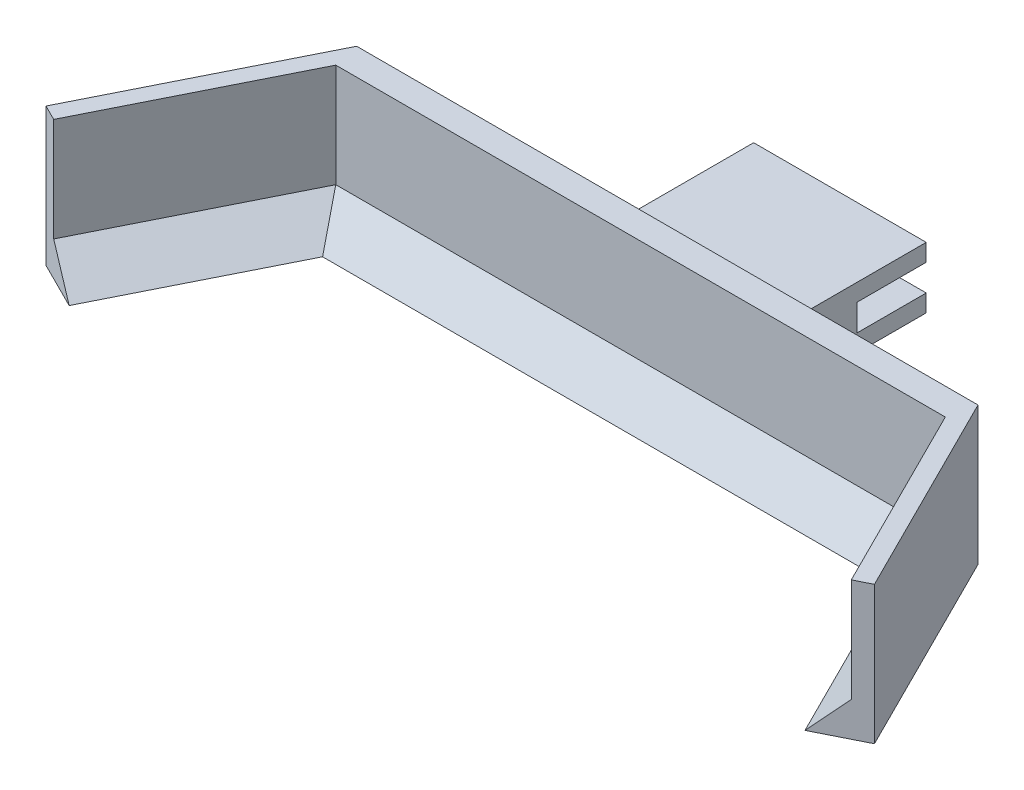
ISO-10303-21;
HEADER;
FILE_DESCRIPTION(('STEP AP214'),'2;1');
FILE_NAME('part.step','',(''),(''),'','','');
FILE_SCHEMA(('AUTOMOTIVE_DESIGN { 1 0 10303 214 1 1 1 1 }'));
ENDSEC;
DATA;
#1=APPLICATION_CONTEXT('core data for automotive mechanical design processes');
#2=APPLICATION_PROTOCOL_DEFINITION('international standard','automotive_design',2000,#1);
#3=PRODUCT_CONTEXT('',#1,'mechanical');
#4=PRODUCT('Part','Part','',(#3));
#5=PRODUCT_RELATED_PRODUCT_CATEGORY('part','',(#4));
#6=PRODUCT_DEFINITION_FORMATION('','',#4);
#7=PRODUCT_DEFINITION_CONTEXT('part definition',#1,'design');
#8=PRODUCT_DEFINITION('design','',#6,#7);
#9=PRODUCT_DEFINITION_SHAPE('','',#8);
#10=(LENGTH_UNIT() NAMED_UNIT(*) SI_UNIT(.MILLI.,.METRE.));
#11=(NAMED_UNIT(*) PLANE_ANGLE_UNIT() SI_UNIT($,.RADIAN.));
#12=(NAMED_UNIT(*) SI_UNIT($,.STERADIAN.) SOLID_ANGLE_UNIT());
#13=UNCERTAINTY_MEASURE_WITH_UNIT(LENGTH_MEASURE(1.E-05),#10,'distance_accuracy_value','');
#14=(GEOMETRIC_REPRESENTATION_CONTEXT(3) GLOBAL_UNCERTAINTY_ASSIGNED_CONTEXT((#13)) GLOBAL_UNIT_ASSIGNED_CONTEXT((#10,
#11,#12)) REPRESENTATION_CONTEXT('',''));
#15=CARTESIAN_POINT('',(0.,0.,0.));
#16=DIRECTION('',(0.,0.,1.));
#17=DIRECTION('',(1.,0.,0.));
#18=AXIS2_PLACEMENT_3D('',#15,#16,#17);
#19=CARTESIAN_POINT('',(0.,0.,-55.));
#20=DIRECTION('',(0.,0.,1.));
#21=DIRECTION('',(1.,0.,0.));
#22=AXIS2_PLACEMENT_3D('',#19,#20,#21);
#23=PLANE('',#22);
#24=DIRECTION('',(0.,-1.,0.));
#25=VECTOR('',#24,1.);
#26=CARTESIAN_POINT('',(25.,5.6,-55.));
#27=LINE('',#26,#25);
#28=CARTESIAN_POINT('',(25.,23.3,-55.));
#29=VERTEX_POINT('',#28);
#30=CARTESIAN_POINT('',(25.,18.3,-55.));
#31=VERTEX_POINT('',#30);
#32=EDGE_CURVE('E199',#29,#31,#27,.T.);
#33=ORIENTED_EDGE('',*,*,#32,.T.);
#34=DIRECTION('',(1.,0.,0.));
#35=VECTOR('',#34,1.);
#36=CARTESIAN_POINT('',(25.,18.3,-55.));
#37=LINE('',#36,#35);
#38=CARTESIAN_POINT('',(-25.,18.3,-55.));
#39=VERTEX_POINT('',#38);
#40=EDGE_CURVE('E181',#39,#31,#37,.T.);
#41=ORIENTED_EDGE('',*,*,#40,.F.);
#42=DIRECTION('',(0.,1.,0.));
#43=VECTOR('',#42,1.);
#44=CARTESIAN_POINT('',(-25.,5.6,-55.));
#45=LINE('',#44,#43);
#46=CARTESIAN_POINT('',(-25.,23.3,-55.));
#47=VERTEX_POINT('',#46);
#48=EDGE_CURVE('E197',#39,#47,#45,.T.);
#49=ORIENTED_EDGE('',*,*,#48,.T.);
#50=DIRECTION('',(1.,0.,0.));
#51=VECTOR('',#50,1.);
#52=CARTESIAN_POINT('',(25.,23.3,-55.));
#53=LINE('',#52,#51);
#54=EDGE_CURVE('E196',#47,#29,#53,.T.);
#55=ORIENTED_EDGE('',*,*,#54,.T.);
#56=EDGE_LOOP('',(#33,#41,#49,#55));
#57=FACE_BOUND('',#56,.T.);
#58=ADVANCED_FACE('F39',(#57),#23,.F.);
#59=CARTESIAN_POINT('',(-90.,10.,-5.));
#60=DIRECTION('',(0.,0.,1.));
#61=DIRECTION('',(1.,0.,0.));
#62=AXIS2_PLACEMENT_3D('',#59,#60,#61);
#63=PLANE('',#62);
#64=DIRECTION('',(-1.,0.,0.));
#65=VECTOR('',#64,1.);
#66=CARTESIAN_POINT('',(-90.,0.,-5.));
#67=LINE('',#66,#65);
#68=CARTESIAN_POINT('',(90.,0.,-5.));
#69=VERTEX_POINT('',#68);
#70=CARTESIAN_POINT('',(-90.,0.,-5.));
#71=VERTEX_POINT('',#70);
#72=EDGE_CURVE('E264',#69,#71,#67,.T.);
#73=ORIENTED_EDGE('',*,*,#72,.T.);
#74=DIRECTION('',(0.,-1.,0.));
#75=VECTOR('',#74,1.);
#76=CARTESIAN_POINT('',(-90.,10.,-5.));
#77=LINE('',#76,#75);
#78=CARTESIAN_POINT('',(-90.,40.,-5.));
#79=VERTEX_POINT('',#78);
#80=EDGE_CURVE('E270',#79,#71,#77,.T.);
#81=ORIENTED_EDGE('',*,*,#80,.F.);
#82=DIRECTION('',(-1.,0.,0.));
#83=VECTOR('',#82,1.);
#84=CARTESIAN_POINT('',(-90.,40.,-5.));
#85=LINE('',#84,#83);
#86=CARTESIAN_POINT('',(90.,40.,-5.));
#87=VERTEX_POINT('',#86);
#88=EDGE_CURVE('E241',#87,#79,#85,.T.);
#89=ORIENTED_EDGE('',*,*,#88,.F.);
#90=DIRECTION('',(0.,-1.,0.));
#91=VECTOR('',#90,1.);
#92=CARTESIAN_POINT('',(90.,10.,-5.));
#93=LINE('',#92,#91);
#94=EDGE_CURVE('E284',#87,#69,#93,.T.);
#95=ORIENTED_EDGE('',*,*,#94,.T.);
#96=EDGE_LOOP('',(#73,#81,#89,#95));
#97=FACE_BOUND('',#96,.T.);
#98=DIRECTION('',(0.,1.,0.));
#99=VECTOR('',#98,1.);
#100=CARTESIAN_POINT('',(-25.,5.6,-5.));
#101=LINE('',#100,#99);
#102=CARTESIAN_POINT('',(-25.,5.6,-5.));
#103=VERTEX_POINT('',#102);
#104=CARTESIAN_POINT('',(-25.,23.3,-5.));
#105=VERTEX_POINT('',#104);
#106=EDGE_CURVE('E64',#103,#105,#101,.T.);
#107=ORIENTED_EDGE('',*,*,#106,.F.);
#108=DIRECTION('',(-1.,0.,0.));
#109=VECTOR('',#108,1.);
#110=CARTESIAN_POINT('',(25.,5.6,-5.));
#111=LINE('',#110,#109);
#112=CARTESIAN_POINT('',(25.,5.6,-5.));
#113=VERTEX_POINT('',#112);
#114=EDGE_CURVE('E213',#113,#103,#111,.T.);
#115=ORIENTED_EDGE('',*,*,#114,.F.);
#116=DIRECTION('',(0.,-1.,0.));
#117=VECTOR('',#116,1.);
#118=CARTESIAN_POINT('',(25.,5.6,-5.));
#119=LINE('',#118,#117);
#120=CARTESIAN_POINT('',(25.,23.3,-5.));
#121=VERTEX_POINT('',#120);
#122=EDGE_CURVE('E210',#121,#113,#119,.T.);
#123=ORIENTED_EDGE('',*,*,#122,.F.);
#124=DIRECTION('',(1.,0.,0.));
#125=VECTOR('',#124,1.);
#126=CARTESIAN_POINT('',(25.,23.3,-5.));
#127=LINE('',#126,#125);
#128=EDGE_CURVE('E206',#105,#121,#127,.T.);
#129=ORIENTED_EDGE('',*,*,#128,.F.);
#130=EDGE_LOOP('',(#107,#115,#123,#129));
#131=FACE_BOUND('',#130,.T.);
#132=ADVANCED_FACE('F341',(#97,#131),#63,.F.);
#133=CARTESIAN_POINT('',(-90.,10.,-5.));
#134=DIRECTION('',(0.894427190999916,0.,0.447213595499958));
#135=DIRECTION('',(0.447213595499958,0.,-0.894427190999916));
#136=AXIS2_PLACEMENT_3D('',#133,#134,#135);
#137=PLANE('',#136);
#138=DIRECTION('',(-0.447213595499958,0.,0.894427190999916));
#139=VECTOR('',#138,1.);
#140=CARTESIAN_POINT('',(-90.,0.,-5.));
#141=LINE('',#140,#139);
#142=CARTESIAN_POINT('',(-120.,0.,55.));
#143=VERTEX_POINT('',#142);
#144=EDGE_CURVE('E259',#71,#143,#141,.T.);
#145=ORIENTED_EDGE('',*,*,#144,.T.);
#146=DIRECTION('',(0.,-1.,0.));
#147=VECTOR('',#146,1.);
#148=CARTESIAN_POINT('',(-120.,10.,55.));
#149=LINE('',#148,#147);
#150=CARTESIAN_POINT('',(-120.,40.,55.));
#151=VERTEX_POINT('',#150);
#152=EDGE_CURVE('E11',#151,#143,#149,.T.);
#153=ORIENTED_EDGE('',*,*,#152,.F.);
#154=DIRECTION('',(-0.447213595499958,0.,0.894427190999916));
#155=VECTOR('',#154,1.);
#156=CARTESIAN_POINT('',(-120.,40.,55.));
#157=LINE('',#156,#155);
#158=EDGE_CURVE('E244',#79,#151,#157,.T.);
#159=ORIENTED_EDGE('',*,*,#158,.F.);
#160=ORIENTED_EDGE('',*,*,#80,.T.);
#161=EDGE_LOOP('',(#145,#153,#159,#160));
#162=FACE_BOUND('',#161,.T.);
#163=ADVANCED_FACE('F337',(#162),#137,.F.);
#164=CARTESIAN_POINT('',(-120.,10.,55.));
#165=DIRECTION('',(0.447213595499958,0.,-0.894427190999916));
#166=DIRECTION('',(-0.894427190999916,0.,-0.447213595499958));
#167=AXIS2_PLACEMENT_3D('',#164,#165,#166);
#168=PLANE('',#167);
#169=DIRECTION('',(0.894427190999916,0.,0.447213595499958));
#170=VECTOR('',#169,1.);
#171=CARTESIAN_POINT('',(-120.,0.,55.));
#172=LINE('',#171,#170);
#173=CARTESIAN_POINT('',(-106.583592135001,0.,61.7082039324994));
#174=VERTEX_POINT('',#173);
#175=EDGE_CURVE('E273',#143,#174,#172,.T.);
#176=ORIENTED_EDGE('',*,*,#175,.T.);
#177=DIRECTION('',(-0.632455532033677,0.707106781186546,-0.316227766016839));
#178=VECTOR('',#177,1.);
#179=CARTESIAN_POINT('',(-115.527864045,10.,57.2360679774998));
#180=LINE('',#179,#178);
#181=CARTESIAN_POINT('',(-115.527864045,10.,57.2360679774998));
#182=VERTEX_POINT('',#181);
#183=EDGE_CURVE('E48',#182,#174,#180,.F.);
#184=ORIENTED_EDGE('',*,*,#183,.F.);
#185=DIRECTION('',(0.,-1.,0.));
#186=VECTOR('',#185,1.);
#187=CARTESIAN_POINT('',(-115.527864045,40.,57.2360679774998));
#188=LINE('',#187,#186);
#189=CARTESIAN_POINT('',(-115.527864045,40.,57.2360679774998));
#190=VERTEX_POINT('',#189);
#191=EDGE_CURVE('E256',#190,#182,#188,.T.);
#192=ORIENTED_EDGE('',*,*,#191,.F.);
#193=DIRECTION('',(0.894427190999916,0.,0.447213595499958));
#194=VECTOR('',#193,1.);
#195=CARTESIAN_POINT('',(-115.527864045,40.,57.2360679774998));
#196=LINE('',#195,#194);
#197=EDGE_CURVE('E226',#151,#190,#196,.T.);
#198=ORIENTED_EDGE('',*,*,#197,.F.);
#199=ORIENTED_EDGE('',*,*,#152,.T.);
#200=EDGE_LOOP('',(#176,#184,#192,#198,#199));
#201=FACE_BOUND('',#200,.T.);
#202=ADVANCED_FACE('F334',(#201),#168,.F.);
#203=CARTESIAN_POINT('',(-88.2917960675006,10.,2.76393202250021));
#204=DIRECTION('',(0.632455532033675,0.707106781186549,0.316227766016837));
#205=DIRECTION('',(-0.745355992499931,0.666666666666665,0.));
#206=AXIS2_PLACEMENT_3D('',#203,#204,#205);
#207=PLANE('',#206);
#208=DIRECTION('',(-0.447213595499958,0.,0.894427190999916));
#209=VECTOR('',#208,1.);
#210=CARTESIAN_POINT('',(-79.3475241575014,0.,7.2360679774998));
#211=LINE('',#210,#209);
#212=CARTESIAN_POINT('',(-82.1114561800016,0.,12.7639320225002));
#213=VERTEX_POINT('',#212);
#214=EDGE_CURVE('E275',#174,#213,#211,.F.);
#215=ORIENTED_EDGE('',*,*,#214,.T.);
#216=DIRECTION('',(0.400446571456079,-0.647936163294297,0.647936163294299));
#217=VECTOR('',#216,1.);
#218=CARTESIAN_POINT('',(-88.2917960675006,10.,2.76393202250021));
#219=LINE('',#218,#217);
#220=CARTESIAN_POINT('',(-88.2917960675006,10.,2.76393202250021));
#221=VERTEX_POINT('',#220);
#222=EDGE_CURVE('E293',#221,#213,#219,.T.);
#223=ORIENTED_EDGE('',*,*,#222,.F.);
#224=DIRECTION('',(0.447213595499958,0.,-0.894427190999916));
#225=VECTOR('',#224,1.);
#226=CARTESIAN_POINT('',(-88.2917960675006,10.,2.76393202250021));
#227=LINE('',#226,#225);
#228=EDGE_CURVE('E260',#182,#221,#227,.T.);
#229=ORIENTED_EDGE('',*,*,#228,.F.);
#230=ORIENTED_EDGE('',*,*,#183,.T.);
#231=EDGE_LOOP('',(#215,#223,#229,#230));
#232=FACE_BOUND('',#231,.T.);
#233=ADVANCED_FACE('F41',(#232),#207,.T.);
#234=CARTESIAN_POINT('',(-88.2917960675006,10.,2.76393202250021));
#235=DIRECTION('',(0.,0.707106781186549,0.707106781186546));
#236=DIRECTION('',(0.,-0.707106781186546,0.707106781186549));
#237=AXIS2_PLACEMENT_3D('',#234,#235,#236);
#238=PLANE('',#237);
#239=DIRECTION('',(-1.,0.,0.));
#240=VECTOR('',#239,1.);
#241=CARTESIAN_POINT('',(-88.2917960675006,0.,12.7639320225002));
#242=LINE('',#241,#240);
#243=CARTESIAN_POINT('',(82.1114561800017,0.,12.7639320225002));
#244=VERTEX_POINT('',#243);
#245=EDGE_CURVE('E297',#213,#244,#242,.F.);
#246=ORIENTED_EDGE('',*,*,#245,.T.);
#247=DIRECTION('',(-0.400446571456079,-0.647936163294297,0.647936163294299));
#248=VECTOR('',#247,1.);
#249=CARTESIAN_POINT('',(59.9753003570419,-35.8170525018126,48.580984524313));
#250=LINE('',#249,#248);
#251=CARTESIAN_POINT('',(88.2917960675006,10.,2.76393202250021));
#252=VERTEX_POINT('',#251);
#253=EDGE_CURVE('E290',#252,#244,#250,.T.);
#254=ORIENTED_EDGE('',*,*,#253,.F.);
#255=DIRECTION('',(1.,0.,0.));
#256=VECTOR('',#255,1.);
#257=CARTESIAN_POINT('',(-88.2917960675006,10.,2.76393202250021));
#258=LINE('',#257,#256);
#259=EDGE_CURVE('E263',#221,#252,#258,.T.);
#260=ORIENTED_EDGE('',*,*,#259,.F.);
#261=ORIENTED_EDGE('',*,*,#222,.T.);
#262=EDGE_LOOP('',(#246,#254,#260,#261));
#263=FACE_BOUND('',#262,.T.);
#264=ADVANCED_FACE('F312',(#263),#238,.T.);
#265=CARTESIAN_POINT('',(88.2917960675006,10.,2.76393202250021));
#266=DIRECTION('',(-0.632455532033675,0.707106781186549,0.316227766016837));
#267=DIRECTION('',(-0.745355992499931,-0.666666666666665,0.));
#268=AXIS2_PLACEMENT_3D('',#265,#266,#267);
#269=PLANE('',#268);
#270=DIRECTION('',(-0.447213595499958,0.,-0.894427190999916));
#271=VECTOR('',#270,1.);
#272=CARTESIAN_POINT('',(79.3475241575014,0.,7.2360679774998));
#273=LINE('',#272,#271);
#274=CARTESIAN_POINT('',(106.583592135001,0.,61.7082039324994));
#275=VERTEX_POINT('',#274);
#276=EDGE_CURVE('E279',#244,#275,#273,.F.);
#277=ORIENTED_EDGE('',*,*,#276,.T.);
#278=DIRECTION('',(0.632455532033677,0.707106781186546,-0.316227766016838));
#279=VECTOR('',#278,1.);
#280=CARTESIAN_POINT('',(115.527864045,10.,57.2360679774998));
#281=LINE('',#280,#279);
#282=CARTESIAN_POINT('',(115.527864045,10.,57.2360679774998));
#283=VERTEX_POINT('',#282);
#284=EDGE_CURVE('E43',#283,#275,#281,.F.);
#285=ORIENTED_EDGE('',*,*,#284,.F.);
#286=DIRECTION('',(0.447213595499958,0.,0.894427190999916));
#287=VECTOR('',#286,1.);
#288=CARTESIAN_POINT('',(88.2917960675006,10.,2.76393202250021));
#289=LINE('',#288,#287);
#290=EDGE_CURVE('E267',#252,#283,#289,.T.);
#291=ORIENTED_EDGE('',*,*,#290,.F.);
#292=ORIENTED_EDGE('',*,*,#253,.T.);
#293=EDGE_LOOP('',(#277,#285,#291,#292));
#294=FACE_BOUND('',#293,.T.);
#295=ADVANCED_FACE('F316',(#294),#269,.T.);
#296=CARTESIAN_POINT('',(115.527864045,10.,57.2360679774998));
#297=DIRECTION('',(-0.447213595499957,0.,-0.894427190999917));
#298=DIRECTION('',(-0.894427190999917,0.,0.447213595499957));
#299=AXIS2_PLACEMENT_3D('',#296,#297,#298);
#300=PLANE('',#299);
#301=DIRECTION('',(0.894427190999916,0.,-0.447213595499957));
#302=VECTOR('',#301,1.);
#303=CARTESIAN_POINT('',(115.527864045,0.,57.2360679774998));
#304=LINE('',#303,#302);
#305=CARTESIAN_POINT('',(120.,0.,55.));
#306=VERTEX_POINT('',#305);
#307=EDGE_CURVE('E276',#275,#306,#304,.T.);
#308=ORIENTED_EDGE('',*,*,#307,.T.);
#309=DIRECTION('',(0.,-1.,0.));
#310=VECTOR('',#309,1.);
#311=CARTESIAN_POINT('',(120.,10.,55.));
#312=LINE('',#311,#310);
#313=CARTESIAN_POINT('',(120.,40.,55.));
#314=VERTEX_POINT('',#313);
#315=EDGE_CURVE('E287',#314,#306,#312,.T.);
#316=ORIENTED_EDGE('',*,*,#315,.F.);
#317=DIRECTION('',(0.894427190999916,0.,-0.447213595499957));
#318=VECTOR('',#317,1.);
#319=CARTESIAN_POINT('',(120.,40.,55.));
#320=LINE('',#319,#318);
#321=CARTESIAN_POINT('',(115.527864045,40.,57.2360679774998));
#322=VERTEX_POINT('',#321);
#323=EDGE_CURVE('E235',#322,#314,#320,.T.);
#324=ORIENTED_EDGE('',*,*,#323,.F.);
#325=DIRECTION('',(0.,-1.,0.));
#326=VECTOR('',#325,1.);
#327=CARTESIAN_POINT('',(115.527864045,40.,57.2360679774998));
#328=LINE('',#327,#326);
#329=EDGE_CURVE('E247',#322,#283,#328,.T.);
#330=ORIENTED_EDGE('',*,*,#329,.T.);
#331=ORIENTED_EDGE('',*,*,#284,.T.);
#332=EDGE_LOOP('',(#308,#316,#324,#330,#331));
#333=FACE_BOUND('',#332,.T.);
#334=ADVANCED_FACE('F346',(#333),#300,.F.);
#335=CARTESIAN_POINT('',(90.,10.,-5.));
#336=DIRECTION('',(-0.894427190999916,0.,0.447213595499958));
#337=DIRECTION('',(0.447213595499958,0.,0.894427190999916));
#338=AXIS2_PLACEMENT_3D('',#335,#336,#337);
#339=PLANE('',#338);
#340=DIRECTION('',(-0.447213595499958,0.,-0.894427190999916));
#341=VECTOR('',#340,1.);
#342=CARTESIAN_POINT('',(90.,0.,-5.));
#343=LINE('',#342,#341);
#344=EDGE_CURVE('E278',#306,#69,#343,.T.);
#345=ORIENTED_EDGE('',*,*,#344,.T.);
#346=ORIENTED_EDGE('',*,*,#94,.F.);
#347=DIRECTION('',(-0.447213595499958,0.,-0.894427190999916));
#348=VECTOR('',#347,1.);
#349=CARTESIAN_POINT('',(90.,40.,-5.));
#350=LINE('',#349,#348);
#351=EDGE_CURVE('E238',#314,#87,#350,.T.);
#352=ORIENTED_EDGE('',*,*,#351,.F.);
#353=ORIENTED_EDGE('',*,*,#315,.T.);
#354=EDGE_LOOP('',(#345,#346,#352,#353));
#355=FACE_BOUND('',#354,.T.);
#356=ADVANCED_FACE('F344',(#355),#339,.F.);
#357=CARTESIAN_POINT('',(0.,0.,0.));
#358=DIRECTION('',(0.,1.,0.));
#359=DIRECTION('',(0.,0.,1.));
#360=AXIS2_PLACEMENT_3D('',#357,#358,#359);
#361=PLANE('',#360);
#362=ORIENTED_EDGE('',*,*,#144,.F.);
#363=ORIENTED_EDGE('',*,*,#72,.F.);
#364=ORIENTED_EDGE('',*,*,#344,.F.);
#365=ORIENTED_EDGE('',*,*,#307,.F.);
#366=ORIENTED_EDGE('',*,*,#276,.F.);
#367=ORIENTED_EDGE('',*,*,#245,.F.);
#368=ORIENTED_EDGE('',*,*,#214,.F.);
#369=ORIENTED_EDGE('',*,*,#175,.F.);
#370=EDGE_LOOP('',(#362,#363,#364,#365,#366,#367,#368,#369));
#371=FACE_BOUND('',#370,.T.);
#372=ADVANCED_FACE('F308',(#371),#361,.F.);
#373=CARTESIAN_POINT('',(-88.2917960675006,40.,2.76393202250021));
#374=DIRECTION('',(-0.894427190999916,0.,-0.447213595499958));
#375=DIRECTION('',(-0.447213595499958,0.,0.894427190999916));
#376=AXIS2_PLACEMENT_3D('',#373,#374,#375);
#377=PLANE('',#376);
#378=ORIENTED_EDGE('',*,*,#228,.T.);
#379=DIRECTION('',(0.,-1.,0.));
#380=VECTOR('',#379,1.);
#381=CARTESIAN_POINT('',(-88.2917960675006,40.,2.76393202250021));
#382=LINE('',#381,#380);
#383=CARTESIAN_POINT('',(-88.2917960675006,40.,2.76393202250021));
#384=VERTEX_POINT('',#383);
#385=EDGE_CURVE('E253',#384,#221,#382,.T.);
#386=ORIENTED_EDGE('',*,*,#385,.F.);
#387=DIRECTION('',(0.447213595499958,0.,-0.894427190999916));
#388=VECTOR('',#387,1.);
#389=CARTESIAN_POINT('',(-88.2917960675006,40.,2.76393202250021));
#390=LINE('',#389,#388);
#391=EDGE_CURVE('E229',#190,#384,#390,.T.);
#392=ORIENTED_EDGE('',*,*,#391,.F.);
#393=ORIENTED_EDGE('',*,*,#191,.T.);
#394=EDGE_LOOP('',(#378,#386,#392,#393));
#395=FACE_BOUND('',#394,.T.);
#396=ADVANCED_FACE('F333',(#395),#377,.F.);
#397=CARTESIAN_POINT('',(88.2917960675006,40.,2.76393202250021));
#398=DIRECTION('',(0.,0.,-1.));
#399=DIRECTION('',(-1.,0.,0.));
#400=AXIS2_PLACEMENT_3D('',#397,#398,#399);
#401=PLANE('',#400);
#402=ORIENTED_EDGE('',*,*,#259,.T.);
#403=DIRECTION('',(0.,-1.,0.));
#404=VECTOR('',#403,1.);
#405=CARTESIAN_POINT('',(88.2917960675006,40.,2.76393202250021));
#406=LINE('',#405,#404);
#407=CARTESIAN_POINT('',(88.2917960675006,40.,2.76393202250021));
#408=VERTEX_POINT('',#407);
#409=EDGE_CURVE('E250',#408,#252,#406,.T.);
#410=ORIENTED_EDGE('',*,*,#409,.F.);
#411=DIRECTION('',(1.,0.,0.));
#412=VECTOR('',#411,1.);
#413=CARTESIAN_POINT('',(88.2917960675006,40.,2.76393202250021));
#414=LINE('',#413,#412);
#415=EDGE_CURVE('E231',#384,#408,#414,.T.);
#416=ORIENTED_EDGE('',*,*,#415,.F.);
#417=ORIENTED_EDGE('',*,*,#385,.T.);
#418=EDGE_LOOP('',(#402,#410,#416,#417));
#419=FACE_BOUND('',#418,.T.);
#420=ADVANCED_FACE('F322',(#419),#401,.F.);
#421=CARTESIAN_POINT('',(115.527864045,40.,57.2360679774998));
#422=DIRECTION('',(0.894427190999916,0.,-0.447213595499958));
#423=DIRECTION('',(-0.447213595499958,0.,-0.894427190999916));
#424=AXIS2_PLACEMENT_3D('',#421,#422,#423);
#425=PLANE('',#424);
#426=ORIENTED_EDGE('',*,*,#290,.T.);
#427=ORIENTED_EDGE('',*,*,#329,.F.);
#428=DIRECTION('',(0.447213595499958,0.,0.894427190999916));
#429=VECTOR('',#428,1.);
#430=CARTESIAN_POINT('',(115.527864045,40.,57.2360679774998));
#431=LINE('',#430,#429);
#432=EDGE_CURVE('E233',#408,#322,#431,.T.);
#433=ORIENTED_EDGE('',*,*,#432,.F.);
#434=ORIENTED_EDGE('',*,*,#409,.T.);
#435=EDGE_LOOP('',(#426,#427,#433,#434));
#436=FACE_BOUND('',#435,.T.);
#437=ADVANCED_FACE('F326',(#436),#425,.F.);
#438=CARTESIAN_POINT('',(0.,40.,0.));
#439=DIRECTION('',(0.,-1.,0.));
#440=DIRECTION('',(0.,0.,-1.));
#441=AXIS2_PLACEMENT_3D('',#438,#439,#440);
#442=PLANE('',#441);
#443=ORIENTED_EDGE('',*,*,#197,.T.);
#444=ORIENTED_EDGE('',*,*,#391,.T.);
#445=ORIENTED_EDGE('',*,*,#415,.T.);
#446=ORIENTED_EDGE('',*,*,#432,.T.);
#447=ORIENTED_EDGE('',*,*,#323,.T.);
#448=ORIENTED_EDGE('',*,*,#351,.T.);
#449=ORIENTED_EDGE('',*,*,#88,.T.);
#450=ORIENTED_EDGE('',*,*,#158,.T.);
#451=EDGE_LOOP('',(#443,#444,#445,#446,#447,#448,#449,#450));
#452=FACE_BOUND('',#451,.T.);
#453=ADVANCED_FACE('F329',(#452),#442,.F.);
#454=CARTESIAN_POINT('',(-25.,5.6,-55.));
#455=DIRECTION('',(1.,0.,0.));
#456=DIRECTION('',(0.,0.,-1.));
#457=AXIS2_PLACEMENT_3D('',#454,#455,#456);
#458=PLANE('',#457);
#459=ORIENTED_EDGE('',*,*,#48,.F.);
#460=DIRECTION('',(0.,0.,-1.));
#461=VECTOR('',#460,1.);
#462=CARTESIAN_POINT('',(-25.,18.3,-35.));
#463=LINE('',#462,#461);
#464=CARTESIAN_POINT('',(-25.,18.3,-35.));
#465=VERTEX_POINT('',#464);
#466=EDGE_CURVE('E188',#465,#39,#463,.T.);
#467=ORIENTED_EDGE('',*,*,#466,.F.);
#468=DIRECTION('',(0.,1.,0.));
#469=VECTOR('',#468,1.);
#470=CARTESIAN_POINT('',(-25.,10.6,-35.));
#471=LINE('',#470,#469);
#472=CARTESIAN_POINT('',(-25.,10.6,-35.));
#473=VERTEX_POINT('',#472);
#474=EDGE_CURVE('E171',#473,#465,#471,.T.);
#475=ORIENTED_EDGE('',*,*,#474,.F.);
#476=DIRECTION('',(0.,0.,-1.));
#477=VECTOR('',#476,1.);
#478=CARTESIAN_POINT('',(-25.,10.6,-35.));
#479=LINE('',#478,#477);
#480=CARTESIAN_POINT('',(-25.,10.6,-55.));
#481=VERTEX_POINT('',#480);
#482=EDGE_CURVE('E168',#473,#481,#479,.T.);
#483=ORIENTED_EDGE('',*,*,#482,.T.);
#484=CARTESIAN_POINT('',(-25.,5.6,-55.));
#485=VERTEX_POINT('',#484);
#486=EDGE_CURVE('E193',#485,#481,#45,.T.);
#487=ORIENTED_EDGE('',*,*,#486,.F.);
#488=DIRECTION('',(0.,0.,1.));
#489=VECTOR('',#488,1.);
#490=CARTESIAN_POINT('',(-25.,5.6,-55.));
#491=LINE('',#490,#489);
#492=EDGE_CURVE('E204',#485,#103,#491,.T.);
#493=ORIENTED_EDGE('',*,*,#492,.T.);
#494=ORIENTED_EDGE('',*,*,#106,.T.);
#495=DIRECTION('',(0.,0.,1.));
#496=VECTOR('',#495,1.);
#497=CARTESIAN_POINT('',(-25.,23.3,-55.));
#498=LINE('',#497,#496);
#499=EDGE_CURVE('E223',#47,#105,#498,.T.);
#500=ORIENTED_EDGE('',*,*,#499,.F.);
#501=EDGE_LOOP('',(#459,#467,#475,#483,#487,#493,#494,#500));
#502=FACE_BOUND('',#501,.T.);
#503=ADVANCED_FACE('F385',(#502),#458,.F.);
#504=CARTESIAN_POINT('',(25.,23.3,-55.));
#505=DIRECTION('',(0.,-1.,0.));
#506=DIRECTION('',(0.,0.,-1.));
#507=AXIS2_PLACEMENT_3D('',#504,#505,#506);
#508=PLANE('',#507);
#509=ORIENTED_EDGE('',*,*,#128,.T.);
#510=DIRECTION('',(0.,0.,1.));
#511=VECTOR('',#510,1.);
#512=CARTESIAN_POINT('',(25.,23.3,-55.));
#513=LINE('',#512,#511);
#514=EDGE_CURVE('E220',#29,#121,#513,.T.);
#515=ORIENTED_EDGE('',*,*,#514,.F.);
#516=ORIENTED_EDGE('',*,*,#54,.F.);
#517=ORIENTED_EDGE('',*,*,#499,.T.);
#518=EDGE_LOOP('',(#509,#515,#516,#517));
#519=FACE_BOUND('',#518,.T.);
#520=ADVANCED_FACE('F396',(#519),#508,.F.);
#521=CARTESIAN_POINT('',(25.,5.6,-55.));
#522=DIRECTION('',(-1.,0.,0.));
#523=DIRECTION('',(0.,0.,1.));
#524=AXIS2_PLACEMENT_3D('',#521,#522,#523);
#525=PLANE('',#524);
#526=DIRECTION('',(0.,-1.,0.));
#527=VECTOR('',#526,1.);
#528=CARTESIAN_POINT('',(25.,10.6,-35.));
#529=LINE('',#528,#527);
#530=CARTESIAN_POINT('',(25.,18.3,-35.));
#531=VERTEX_POINT('',#530);
#532=CARTESIAN_POINT('',(25.,10.6,-35.));
#533=VERTEX_POINT('',#532);
#534=EDGE_CURVE('E172',#531,#533,#529,.T.);
#535=ORIENTED_EDGE('',*,*,#534,.F.);
#536=DIRECTION('',(0.,0.,-1.));
#537=VECTOR('',#536,1.);
#538=CARTESIAN_POINT('',(25.,18.3,-35.));
#539=LINE('',#538,#537);
#540=EDGE_CURVE('E207',#531,#31,#539,.T.);
#541=ORIENTED_EDGE('',*,*,#540,.T.);
#542=ORIENTED_EDGE('',*,*,#32,.F.);
#543=ORIENTED_EDGE('',*,*,#514,.T.);
#544=ORIENTED_EDGE('',*,*,#122,.T.);
#545=DIRECTION('',(0.,0.,1.));
#546=VECTOR('',#545,1.);
#547=CARTESIAN_POINT('',(25.,5.6,-55.));
#548=LINE('',#547,#546);
#549=CARTESIAN_POINT('',(25.,5.6,-55.));
#550=VERTEX_POINT('',#549);
#551=EDGE_CURVE('E217',#550,#113,#548,.T.);
#552=ORIENTED_EDGE('',*,*,#551,.F.);
#553=CARTESIAN_POINT('',(25.,10.6,-55.));
#554=VERTEX_POINT('',#553);
#555=EDGE_CURVE('E186',#554,#550,#27,.T.);
#556=ORIENTED_EDGE('',*,*,#555,.F.);
#557=DIRECTION('',(0.,0.,-1.));
#558=VECTOR('',#557,1.);
#559=CARTESIAN_POINT('',(25.,10.6,-35.));
#560=LINE('',#559,#558);
#561=EDGE_CURVE('E56',#533,#554,#560,.T.);
#562=ORIENTED_EDGE('',*,*,#561,.F.);
#563=EDGE_LOOP('',(#535,#541,#542,#543,#544,#552,#556,#562));
#564=FACE_BOUND('',#563,.T.);
#565=ADVANCED_FACE('F184',(#564),#525,.F.);
#566=CARTESIAN_POINT('',(25.,5.6,-55.));
#567=DIRECTION('',(0.,1.,0.));
#568=DIRECTION('',(0.,0.,1.));
#569=AXIS2_PLACEMENT_3D('',#566,#567,#568);
#570=PLANE('',#569);
#571=ORIENTED_EDGE('',*,*,#114,.T.);
#572=ORIENTED_EDGE('',*,*,#492,.F.);
#573=DIRECTION('',(-1.,0.,0.));
#574=VECTOR('',#573,1.);
#575=CARTESIAN_POINT('',(25.,5.6,-55.));
#576=LINE('',#575,#574);
#577=EDGE_CURVE('E202',#550,#485,#576,.T.);
#578=ORIENTED_EDGE('',*,*,#577,.F.);
#579=ORIENTED_EDGE('',*,*,#551,.T.);
#580=EDGE_LOOP('',(#571,#572,#578,#579));
#581=FACE_BOUND('',#580,.T.);
#582=ADVANCED_FACE('F370',(#581),#570,.F.);
#583=ORIENTED_EDGE('',*,*,#486,.T.);
#584=DIRECTION('',(-1.,0.,0.));
#585=VECTOR('',#584,1.);
#586=CARTESIAN_POINT('',(25.,10.6,-55.));
#587=LINE('',#586,#585);
#588=EDGE_CURVE('E380',#554,#481,#587,.T.);
#589=ORIENTED_EDGE('',*,*,#588,.F.);
#590=ORIENTED_EDGE('',*,*,#555,.T.);
#591=ORIENTED_EDGE('',*,*,#577,.T.);
#592=EDGE_LOOP('',(#583,#589,#590,#591));
#593=FACE_BOUND('',#592,.T.);
#594=ADVANCED_FACE('F359',(#593),#23,.F.);
#595=CARTESIAN_POINT('',(25.,18.3,-35.));
#596=DIRECTION('',(0.,1.,0.));
#597=DIRECTION('',(0.,0.,1.));
#598=AXIS2_PLACEMENT_3D('',#595,#596,#597);
#599=PLANE('',#598);
#600=ORIENTED_EDGE('',*,*,#40,.T.);
#601=ORIENTED_EDGE('',*,*,#540,.F.);
#602=DIRECTION('',(1.,0.,0.));
#603=VECTOR('',#602,1.);
#604=CARTESIAN_POINT('',(25.,18.3,-35.));
#605=LINE('',#604,#603);
#606=EDGE_CURVE('E178',#465,#531,#605,.T.);
#607=ORIENTED_EDGE('',*,*,#606,.F.);
#608=ORIENTED_EDGE('',*,*,#466,.T.);
#609=EDGE_LOOP('',(#600,#601,#607,#608));
#610=FACE_BOUND('',#609,.T.);
#611=ADVANCED_FACE('F369',(#610),#599,.F.);
#612=CARTESIAN_POINT('',(25.,10.6,-35.));
#613=DIRECTION('',(0.,-1.,0.));
#614=DIRECTION('',(0.,0.,-1.));
#615=AXIS2_PLACEMENT_3D('',#612,#613,#614);
#616=PLANE('',#615);
#617=ORIENTED_EDGE('',*,*,#588,.T.);
#618=ORIENTED_EDGE('',*,*,#482,.F.);
#619=DIRECTION('',(-1.,0.,0.));
#620=VECTOR('',#619,1.);
#621=CARTESIAN_POINT('',(25.,10.6,-35.));
#622=LINE('',#621,#620);
#623=EDGE_CURVE('E164',#533,#473,#622,.T.);
#624=ORIENTED_EDGE('',*,*,#623,.F.);
#625=ORIENTED_EDGE('',*,*,#561,.T.);
#626=EDGE_LOOP('',(#617,#618,#624,#625));
#627=FACE_BOUND('',#626,.T.);
#628=ADVANCED_FACE('F166',(#627),#616,.F.);
#629=CARTESIAN_POINT('',(0.,0.,-35.));
#630=DIRECTION('',(0.,0.,1.));
#631=DIRECTION('',(1.,0.,0.));
#632=AXIS2_PLACEMENT_3D('',#629,#630,#631);
#633=PLANE('',#632);
#634=ORIENTED_EDGE('',*,*,#534,.T.);
#635=ORIENTED_EDGE('',*,*,#623,.T.);
#636=ORIENTED_EDGE('',*,*,#474,.T.);
#637=ORIENTED_EDGE('',*,*,#606,.T.);
#638=EDGE_LOOP('',(#634,#635,#636,#637));
#639=FACE_BOUND('',#638,.T.);
#640=ADVANCED_FACE('F176',(#639),#633,.F.);
#641=CLOSED_SHELL('',(#58,#132,#163,#202,#233,#264,#295,#334,#356,#372,#396,#420,#437,#453,#503,
#520,#565,#582,#594,#611,#628,#640));
#642=MANIFOLD_SOLID_BREP('B2',#641);
#643=ADVANCED_BREP_SHAPE_REPRESENTATION('',(#18,#642),#14);
#644=SHAPE_DEFINITION_REPRESENTATION(#9,#643);
ENDSEC;
END-ISO-10303-21;
